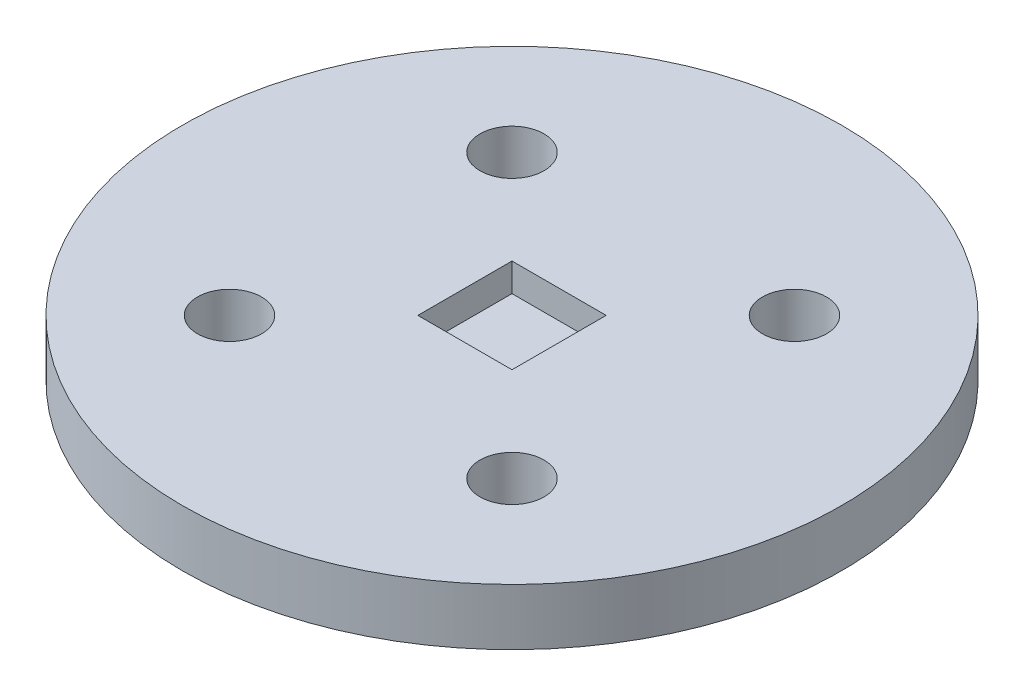
ISO-10303-21;
HEADER;
FILE_DESCRIPTION(('STEP AP214'),'2;1');
FILE_NAME('part.step','',(''),(''),'','','');
FILE_SCHEMA(('AUTOMOTIVE_DESIGN { 1 0 10303 214 1 1 1 1 }'));
ENDSEC;
DATA;
#1=APPLICATION_CONTEXT('core data for automotive mechanical design processes');
#2=APPLICATION_PROTOCOL_DEFINITION('international standard','automotive_design',2000,#1);
#3=PRODUCT_CONTEXT('',#1,'mechanical');
#4=PRODUCT('Part','Part','',(#3));
#5=PRODUCT_RELATED_PRODUCT_CATEGORY('part','',(#4));
#6=PRODUCT_DEFINITION_FORMATION('','',#4);
#7=PRODUCT_DEFINITION_CONTEXT('part definition',#1,'design');
#8=PRODUCT_DEFINITION('design','',#6,#7);
#9=PRODUCT_DEFINITION_SHAPE('','',#8);
#10=(LENGTH_UNIT() NAMED_UNIT(*) SI_UNIT(.MILLI.,.METRE.));
#11=(NAMED_UNIT(*) PLANE_ANGLE_UNIT() SI_UNIT($,.RADIAN.));
#12=(NAMED_UNIT(*) SI_UNIT($,.STERADIAN.) SOLID_ANGLE_UNIT());
#13=UNCERTAINTY_MEASURE_WITH_UNIT(LENGTH_MEASURE(1.E-05),#10,'distance_accuracy_value','');
#14=(GEOMETRIC_REPRESENTATION_CONTEXT(3) GLOBAL_UNCERTAINTY_ASSIGNED_CONTEXT((#13)) GLOBAL_UNIT_ASSIGNED_CONTEXT((#10,
#11,#12)) REPRESENTATION_CONTEXT('',''));
#15=CARTESIAN_POINT('',(0.,0.,0.));
#16=DIRECTION('',(0.,0.,1.));
#17=DIRECTION('',(1.,0.,0.));
#18=AXIS2_PLACEMENT_3D('',#15,#16,#17);
#19=CARTESIAN_POINT('',(0.,6.,0.));
#20=DIRECTION('',(0.,-1.,0.));
#21=DIRECTION('',(0.,0.,-1.));
#22=AXIS2_PLACEMENT_3D('',#19,#20,#21);
#23=CYLINDRICAL_SURFACE('',#22,35.);
#24=CARTESIAN_POINT('',(0.,6.,0.));
#25=DIRECTION('',(0.,1.,0.));
#26=DIRECTION('',(0.,0.,1.));
#27=AXIS2_PLACEMENT_3D('',#24,#25,#26);
#28=CIRCLE('',#27,35.);
#29=CARTESIAN_POINT('',(0.,6.,35.));
#30=VERTEX_POINT('',#29);
#31=EDGE_CURVE('E11',#30,#30,#28,.T.);
#32=ORIENTED_EDGE('',*,*,#31,.F.);
#33=EDGE_LOOP('',(#32));
#34=FACE_BOUND('',#33,.T.);
#35=CARTESIAN_POINT('',(0.,0.,0.));
#36=DIRECTION('',(0.,1.,0.));
#37=DIRECTION('',(0.,0.,1.));
#38=AXIS2_PLACEMENT_3D('',#35,#36,#37);
#39=CIRCLE('',#38,35.);
#40=CARTESIAN_POINT('',(0.,0.,35.));
#41=VERTEX_POINT('',#40);
#42=EDGE_CURVE('E42',#41,#41,#39,.T.);
#43=ORIENTED_EDGE('',*,*,#42,.T.);
#44=EDGE_LOOP('',(#43));
#45=FACE_BOUND('',#44,.T.);
#46=ADVANCED_FACE('F39',(#34,#45),#23,.T.);
#47=CARTESIAN_POINT('',(0.,6.,0.));
#48=DIRECTION('',(0.,1.,0.));
#49=DIRECTION('',(0.,0.,1.));
#50=AXIS2_PLACEMENT_3D('',#47,#48,#49);
#51=PLANE('',#50);
#52=CARTESIAN_POINT('',(-15.,6.,-15.));
#53=DIRECTION('',(0.,-1.,0.));
#54=DIRECTION('',(0.,0.,-1.));
#55=AXIS2_PLACEMENT_3D('',#52,#53,#54);
#56=CIRCLE('',#55,3.4);
#57=CARTESIAN_POINT('',(-15.,6.,-18.4));
#58=VERTEX_POINT('',#57);
#59=EDGE_CURVE('E365',#58,#58,#56,.T.);
#60=ORIENTED_EDGE('',*,*,#59,.T.);
#61=EDGE_LOOP('',(#60));
#62=FACE_BOUND('',#61,.T.);
#63=CARTESIAN_POINT('',(15.,6.,15.));
#64=DIRECTION('',(0.,-1.,0.));
#65=DIRECTION('',(0.,0.,-1.));
#66=AXIS2_PLACEMENT_3D('',#63,#64,#65);
#67=CIRCLE('',#66,3.4);
#68=CARTESIAN_POINT('',(15.,6.,11.6));
#69=VERTEX_POINT('',#68);
#70=EDGE_CURVE('E374',#69,#69,#67,.T.);
#71=ORIENTED_EDGE('',*,*,#70,.T.);
#72=EDGE_LOOP('',(#71));
#73=FACE_BOUND('',#72,.T.);
#74=CARTESIAN_POINT('',(-15.,6.,15.));
#75=DIRECTION('',(0.,-1.,0.));
#76=DIRECTION('',(0.,0.,-1.));
#77=AXIS2_PLACEMENT_3D('',#74,#75,#76);
#78=CIRCLE('',#77,3.4);
#79=CARTESIAN_POINT('',(-15.,6.,11.6));
#80=VERTEX_POINT('',#79);
#81=EDGE_CURVE('E357',#80,#80,#78,.T.);
#82=ORIENTED_EDGE('',*,*,#81,.T.);
#83=EDGE_LOOP('',(#82));
#84=FACE_BOUND('',#83,.T.);
#85=CARTESIAN_POINT('',(15.,6.,-15.));
#86=DIRECTION('',(0.,-1.,0.));
#87=DIRECTION('',(0.,0.,-1.));
#88=AXIS2_PLACEMENT_3D('',#85,#86,#87);
#89=CIRCLE('',#88,3.4);
#90=CARTESIAN_POINT('',(15.,6.,-18.4));
#91=VERTEX_POINT('',#90);
#92=EDGE_CURVE('E381',#91,#91,#89,.T.);
#93=ORIENTED_EDGE('',*,*,#92,.T.);
#94=EDGE_LOOP('',(#93));
#95=FACE_BOUND('',#94,.T.);
#96=DIRECTION('',(0.,0.,-1.));
#97=VECTOR('',#96,1.);
#98=CARTESIAN_POINT('',(5.,6.,5.));
#99=LINE('',#98,#97);
#100=CARTESIAN_POINT('',(5.,6.,5.));
#101=VERTEX_POINT('',#100);
#102=CARTESIAN_POINT('',(5.,6.,-5.));
#103=VERTEX_POINT('',#102);
#104=EDGE_CURVE('E385',#101,#103,#99,.T.);
#105=ORIENTED_EDGE('',*,*,#104,.F.);
#106=DIRECTION('',(1.,0.,0.));
#107=VECTOR('',#106,1.);
#108=CARTESIAN_POINT('',(-5.,6.,5.));
#109=LINE('',#108,#107);
#110=CARTESIAN_POINT('',(-5.,6.,5.));
#111=VERTEX_POINT('',#110);
#112=EDGE_CURVE('E394',#111,#101,#109,.T.);
#113=ORIENTED_EDGE('',*,*,#112,.F.);
#114=DIRECTION('',(0.,0.,1.));
#115=VECTOR('',#114,1.);
#116=CARTESIAN_POINT('',(-5.,6.,5.));
#117=LINE('',#116,#115);
#118=CARTESIAN_POINT('',(-5.,6.,-5.));
#119=VERTEX_POINT('',#118);
#120=EDGE_CURVE('E413',#119,#111,#117,.T.);
#121=ORIENTED_EDGE('',*,*,#120,.F.);
#122=DIRECTION('',(-1.,0.,0.));
#123=VECTOR('',#122,1.);
#124=CARTESIAN_POINT('',(-5.,6.,-5.));
#125=LINE('',#124,#123);
#126=EDGE_CURVE('E409',#103,#119,#125,.T.);
#127=ORIENTED_EDGE('',*,*,#126,.F.);
#128=EDGE_LOOP('',(#105,#113,#121,#127));
#129=FACE_BOUND('',#128,.T.);
#130=ORIENTED_EDGE('',*,*,#31,.T.);
#131=EDGE_LOOP('',(#130));
#132=FACE_BOUND('',#131,.T.);
#133=ADVANCED_FACE('F440',(#62,#73,#84,#95,#129,#132),#51,.T.);
#134=CARTESIAN_POINT('',(0.,0.,0.));
#135=DIRECTION('',(0.,1.,0.));
#136=DIRECTION('',(0.,0.,1.));
#137=AXIS2_PLACEMENT_3D('',#134,#135,#136);
#138=PLANE('',#137);
#139=DIRECTION('',(0.,0.,-1.));
#140=VECTOR('',#139,1.);
#141=CARTESIAN_POINT('',(-26.1991505127554,0.,-3.09645220662024));
#142=LINE('',#141,#140);
#143=CARTESIAN_POINT('',(-26.1991505127555,0.,3.10354779337976));
#144=VERTEX_POINT('',#143);
#145=CARTESIAN_POINT('',(-26.1991505127554,0.,-3.09645220662024));
#146=VERTEX_POINT('',#145);
#147=EDGE_CURVE('E212',#144,#146,#142,.T.);
#148=ORIENTED_EDGE('',*,*,#147,.F.);
#149=DIRECTION('',(-1.,0.,0.));
#150=VECTOR('',#149,1.);
#151=CARTESIAN_POINT('',(-19.9991505127555,0.,3.10354779337978));
#152=LINE('',#151,#150);
#153=CARTESIAN_POINT('',(-19.9991505127555,0.,3.10354779337978));
#154=VERTEX_POINT('',#153);
#155=EDGE_CURVE('E54',#154,#144,#152,.T.);
#156=ORIENTED_EDGE('',*,*,#155,.F.);
#157=DIRECTION('',(0.,0.,1.));
#158=VECTOR('',#157,1.);
#159=CARTESIAN_POINT('',(-19.9991505127554,0.,-3.09645220662022));
#160=LINE('',#159,#158);
#161=CARTESIAN_POINT('',(-19.9991505127554,0.,-3.09645220662022));
#162=VERTEX_POINT('',#161);
#163=EDGE_CURVE('E199',#162,#154,#160,.T.);
#164=ORIENTED_EDGE('',*,*,#163,.F.);
#165=DIRECTION('',(1.,0.,0.));
#166=VECTOR('',#165,1.);
#167=CARTESIAN_POINT('',(-19.9991505127554,0.,-3.09645220662022));
#168=LINE('',#167,#166);
#169=EDGE_CURVE('E203',#146,#162,#168,.T.);
#170=ORIENTED_EDGE('',*,*,#169,.F.);
#171=EDGE_LOOP('',(#148,#156,#164,#170));
#172=FACE_BOUND('',#171,.T.);
#173=DIRECTION('',(-1.,0.,0.));
#174=VECTOR('',#173,1.);
#175=CARTESIAN_POINT('',(-3.09645220661991,0.,26.1991505127558));
#176=LINE('',#175,#174);
#177=CARTESIAN_POINT('',(3.10354779338009,0.,26.1991505127558));
#178=VERTEX_POINT('',#177);
#179=CARTESIAN_POINT('',(-3.09645220661991,0.,26.1991505127558));
#180=VERTEX_POINT('',#179);
#181=EDGE_CURVE('E248',#178,#180,#176,.T.);
#182=ORIENTED_EDGE('',*,*,#181,.F.);
#183=DIRECTION('',(0.,0.,1.));
#184=VECTOR('',#183,1.);
#185=CARTESIAN_POINT('',(3.10354779338008,0.,19.9991505127558));
#186=LINE('',#185,#184);
#187=CARTESIAN_POINT('',(3.10354779338008,0.,19.9991505127558));
#188=VERTEX_POINT('',#187);
#189=EDGE_CURVE('E62',#188,#178,#186,.T.);
#190=ORIENTED_EDGE('',*,*,#189,.F.);
#191=DIRECTION('',(1.,0.,0.));
#192=VECTOR('',#191,1.);
#193=CARTESIAN_POINT('',(-3.09645220661992,0.,19.9991505127558));
#194=LINE('',#193,#192);
#195=CARTESIAN_POINT('',(-3.09645220661992,0.,19.9991505127558));
#196=VERTEX_POINT('',#195);
#197=EDGE_CURVE('E233',#196,#188,#194,.T.);
#198=ORIENTED_EDGE('',*,*,#197,.F.);
#199=DIRECTION('',(0.,0.,-1.));
#200=VECTOR('',#199,1.);
#201=CARTESIAN_POINT('',(-3.09645220661992,0.,19.9991505127558));
#202=LINE('',#201,#200);
#203=EDGE_CURVE('E253',#180,#196,#202,.T.);
#204=ORIENTED_EDGE('',*,*,#203,.F.);
#205=EDGE_LOOP('',(#182,#190,#198,#204));
#206=FACE_BOUND('',#205,.T.);
#207=DIRECTION('',(1.,0.,0.));
#208=VECTOR('',#207,1.);
#209=CARTESIAN_POINT('',(3.09645220662065,0.,-26.1991505127557));
#210=LINE('',#209,#208);
#211=CARTESIAN_POINT('',(-3.10354779337935,0.,-26.1991505127557));
#212=VERTEX_POINT('',#211);
#213=CARTESIAN_POINT('',(3.09645220662065,0.,-26.1991505127557));
#214=VERTEX_POINT('',#213);
#215=EDGE_CURVE('E291',#212,#214,#210,.T.);
#216=ORIENTED_EDGE('',*,*,#215,.F.);
#217=DIRECTION('',(0.,0.,-1.));
#218=VECTOR('',#217,1.);
#219=CARTESIAN_POINT('',(-3.10354779337939,0.,-19.9991505127557));
#220=LINE('',#219,#218);
#221=CARTESIAN_POINT('',(-3.10354779337939,0.,-19.9991505127557));
#222=VERTEX_POINT('',#221);
#223=EDGE_CURVE('E288',#222,#212,#220,.T.);
#224=ORIENTED_EDGE('',*,*,#223,.F.);
#225=DIRECTION('',(-1.,0.,0.));
#226=VECTOR('',#225,1.);
#227=CARTESIAN_POINT('',(3.09645220662061,0.,-19.9991505127557));
#228=LINE('',#227,#226);
#229=CARTESIAN_POINT('',(3.09645220662061,0.,-19.9991505127557));
#230=VERTEX_POINT('',#229);
#231=EDGE_CURVE('E275',#230,#222,#228,.T.);
#232=ORIENTED_EDGE('',*,*,#231,.F.);
#233=DIRECTION('',(0.,0.,1.));
#234=VECTOR('',#233,1.);
#235=CARTESIAN_POINT('',(3.09645220662061,0.,-19.9991505127557));
#236=LINE('',#235,#234);
#237=EDGE_CURVE('E296',#214,#230,#236,.T.);
#238=ORIENTED_EDGE('',*,*,#237,.F.);
#239=EDGE_LOOP('',(#216,#224,#232,#238));
#240=FACE_BOUND('',#239,.T.);
#241=DIRECTION('',(0.,0.,1.));
#242=VECTOR('',#241,1.);
#243=CARTESIAN_POINT('',(26.199150512756,0.,3.09645220662051));
#244=LINE('',#243,#242);
#245=CARTESIAN_POINT('',(26.199150512756,0.,-3.10354779337949));
#246=VERTEX_POINT('',#245);
#247=CARTESIAN_POINT('',(26.199150512756,0.,3.09645220662051));
#248=VERTEX_POINT('',#247);
#249=EDGE_CURVE('E335',#246,#248,#244,.T.);
#250=ORIENTED_EDGE('',*,*,#249,.F.);
#251=DIRECTION('',(1.,0.,0.));
#252=VECTOR('',#251,1.);
#253=CARTESIAN_POINT('',(19.999150512756,0.,-3.10354779337955));
#254=LINE('',#253,#252);
#255=CARTESIAN_POINT('',(19.999150512756,0.,-3.10354779337955));
#256=VERTEX_POINT('',#255);
#257=EDGE_CURVE('E332',#256,#246,#254,.T.);
#258=ORIENTED_EDGE('',*,*,#257,.F.);
#259=DIRECTION('',(0.,0.,-1.));
#260=VECTOR('',#259,1.);
#261=CARTESIAN_POINT('',(19.999150512756,0.,3.09645220662045));
#262=LINE('',#261,#260);
#263=CARTESIAN_POINT('',(19.999150512756,0.,3.09645220662045));
#264=VERTEX_POINT('',#263);
#265=EDGE_CURVE('E319',#264,#256,#262,.T.);
#266=ORIENTED_EDGE('',*,*,#265,.F.);
#267=DIRECTION('',(-1.,0.,0.));
#268=VECTOR('',#267,1.);
#269=CARTESIAN_POINT('',(19.999150512756,0.,3.09645220662045));
#270=LINE('',#269,#268);
#271=EDGE_CURVE('E339',#248,#264,#270,.T.);
#272=ORIENTED_EDGE('',*,*,#271,.F.);
#273=EDGE_LOOP('',(#250,#258,#266,#272));
#274=FACE_BOUND('',#273,.T.);
#275=CARTESIAN_POINT('',(-15.,0.,-15.));
#276=DIRECTION('',(0.,-1.,0.));
#277=DIRECTION('',(0.,0.,-1.));
#278=AXIS2_PLACEMENT_3D('',#275,#276,#277);
#279=CIRCLE('',#278,3.4);
#280=CARTESIAN_POINT('',(-15.,0.,-18.4));
#281=VERTEX_POINT('',#280);
#282=EDGE_CURVE('E370',#281,#281,#279,.T.);
#283=ORIENTED_EDGE('',*,*,#282,.F.);
#284=EDGE_LOOP('',(#283));
#285=FACE_BOUND('',#284,.T.);
#286=CARTESIAN_POINT('',(15.,0.,15.));
#287=DIRECTION('',(0.,-1.,0.));
#288=DIRECTION('',(0.,0.,-1.));
#289=AXIS2_PLACEMENT_3D('',#286,#287,#288);
#290=CIRCLE('',#289,3.4);
#291=CARTESIAN_POINT('',(15.,0.,11.6));
#292=VERTEX_POINT('',#291);
#293=EDGE_CURVE('E361',#292,#292,#290,.T.);
#294=ORIENTED_EDGE('',*,*,#293,.F.);
#295=EDGE_LOOP('',(#294));
#296=FACE_BOUND('',#295,.T.);
#297=CARTESIAN_POINT('',(-15.,0.,15.));
#298=DIRECTION('',(0.,-1.,0.));
#299=DIRECTION('',(0.,0.,-1.));
#300=AXIS2_PLACEMENT_3D('',#297,#298,#299);
#301=CIRCLE('',#300,3.4);
#302=CARTESIAN_POINT('',(-15.,0.,11.6));
#303=VERTEX_POINT('',#302);
#304=EDGE_CURVE('E222',#303,#303,#301,.T.);
#305=ORIENTED_EDGE('',*,*,#304,.F.);
#306=EDGE_LOOP('',(#305));
#307=FACE_BOUND('',#306,.T.);
#308=CARTESIAN_POINT('',(15.,0.,-15.));
#309=DIRECTION('',(0.,-1.,0.));
#310=DIRECTION('',(0.,0.,-1.));
#311=AXIS2_PLACEMENT_3D('',#308,#309,#310);
#312=CIRCLE('',#311,3.4);
#313=CARTESIAN_POINT('',(15.,0.,-18.4));
#314=VERTEX_POINT('',#313);
#315=EDGE_CURVE('E369',#314,#314,#312,.T.);
#316=ORIENTED_EDGE('',*,*,#315,.F.);
#317=EDGE_LOOP('',(#316));
#318=FACE_BOUND('',#317,.T.);
#319=ORIENTED_EDGE('',*,*,#42,.F.);
#320=EDGE_LOOP('',(#319));
#321=FACE_BOUND('',#320,.T.);
#322=ADVANCED_FACE('F459',(#172,#206,#240,#274,#285,#296,#307,#318,#321),#138,.F.);
#323=CARTESIAN_POINT('',(5.,3.,5.));
#324=DIRECTION('',(1.,0.,0.));
#325=DIRECTION('',(0.,0.,-1.));
#326=AXIS2_PLACEMENT_3D('',#323,#324,#325);
#327=PLANE('',#326);
#328=ORIENTED_EDGE('',*,*,#104,.T.);
#329=DIRECTION('',(0.,1.,0.));
#330=VECTOR('',#329,1.);
#331=CARTESIAN_POINT('',(5.,3.,-5.));
#332=LINE('',#331,#330);
#333=CARTESIAN_POINT('',(5.,3.,-5.));
#334=VERTEX_POINT('',#333);
#335=EDGE_CURVE('E406',#334,#103,#332,.T.);
#336=ORIENTED_EDGE('',*,*,#335,.F.);
#337=DIRECTION('',(0.,0.,-1.));
#338=VECTOR('',#337,1.);
#339=CARTESIAN_POINT('',(5.,3.,5.));
#340=LINE('',#339,#338);
#341=CARTESIAN_POINT('',(5.,3.,5.));
#342=VERTEX_POINT('',#341);
#343=EDGE_CURVE('E389',#342,#334,#340,.T.);
#344=ORIENTED_EDGE('',*,*,#343,.F.);
#345=DIRECTION('',(0.,1.,0.));
#346=VECTOR('',#345,1.);
#347=CARTESIAN_POINT('',(5.,3.,5.));
#348=LINE('',#347,#346);
#349=EDGE_CURVE('E420',#342,#101,#348,.T.);
#350=ORIENTED_EDGE('',*,*,#349,.T.);
#351=EDGE_LOOP('',(#328,#336,#344,#350));
#352=FACE_BOUND('',#351,.T.);
#353=ADVANCED_FACE('F449',(#352),#327,.F.);
#354=CARTESIAN_POINT('',(-5.,3.,5.));
#355=DIRECTION('',(0.,0.,1.));
#356=DIRECTION('',(1.,0.,0.));
#357=AXIS2_PLACEMENT_3D('',#354,#355,#356);
#358=PLANE('',#357);
#359=ORIENTED_EDGE('',*,*,#112,.T.);
#360=ORIENTED_EDGE('',*,*,#349,.F.);
#361=DIRECTION('',(1.,0.,0.));
#362=VECTOR('',#361,1.);
#363=CARTESIAN_POINT('',(-5.,3.,5.));
#364=LINE('',#363,#362);
#365=CARTESIAN_POINT('',(-5.,3.,5.));
#366=VERTEX_POINT('',#365);
#367=EDGE_CURVE('E402',#366,#342,#364,.T.);
#368=ORIENTED_EDGE('',*,*,#367,.F.);
#369=DIRECTION('',(0.,1.,0.));
#370=VECTOR('',#369,1.);
#371=CARTESIAN_POINT('',(-5.,3.,5.));
#372=LINE('',#371,#370);
#373=EDGE_CURVE('E423',#366,#111,#372,.T.);
#374=ORIENTED_EDGE('',*,*,#373,.T.);
#375=EDGE_LOOP('',(#359,#360,#368,#374));
#376=FACE_BOUND('',#375,.T.);
#377=ADVANCED_FACE('F451',(#376),#358,.F.);
#378=CARTESIAN_POINT('',(-5.,3.,5.));
#379=DIRECTION('',(-1.,0.,0.));
#380=DIRECTION('',(0.,0.,1.));
#381=AXIS2_PLACEMENT_3D('',#378,#379,#380);
#382=PLANE('',#381);
#383=ORIENTED_EDGE('',*,*,#120,.T.);
#384=ORIENTED_EDGE('',*,*,#373,.F.);
#385=DIRECTION('',(0.,0.,1.));
#386=VECTOR('',#385,1.);
#387=CARTESIAN_POINT('',(-5.,3.,5.));
#388=LINE('',#387,#386);
#389=CARTESIAN_POINT('',(-5.,3.,-5.));
#390=VERTEX_POINT('',#389);
#391=EDGE_CURVE('E398',#390,#366,#388,.T.);
#392=ORIENTED_EDGE('',*,*,#391,.F.);
#393=DIRECTION('',(0.,1.,0.));
#394=VECTOR('',#393,1.);
#395=CARTESIAN_POINT('',(-5.,3.,-5.));
#396=LINE('',#395,#394);
#397=EDGE_CURVE('E426',#390,#119,#396,.T.);
#398=ORIENTED_EDGE('',*,*,#397,.T.);
#399=EDGE_LOOP('',(#383,#384,#392,#398));
#400=FACE_BOUND('',#399,.T.);
#401=ADVANCED_FACE('F444',(#400),#382,.F.);
#402=CARTESIAN_POINT('',(-5.,3.,-5.));
#403=DIRECTION('',(0.,0.,-1.));
#404=DIRECTION('',(-1.,0.,0.));
#405=AXIS2_PLACEMENT_3D('',#402,#403,#404);
#406=PLANE('',#405);
#407=ORIENTED_EDGE('',*,*,#126,.T.);
#408=ORIENTED_EDGE('',*,*,#397,.F.);
#409=DIRECTION('',(-1.,0.,0.));
#410=VECTOR('',#409,1.);
#411=CARTESIAN_POINT('',(-5.,3.,-5.));
#412=LINE('',#411,#410);
#413=EDGE_CURVE('E393',#334,#390,#412,.T.);
#414=ORIENTED_EDGE('',*,*,#413,.F.);
#415=ORIENTED_EDGE('',*,*,#335,.T.);
#416=EDGE_LOOP('',(#407,#408,#414,#415));
#417=FACE_BOUND('',#416,.T.);
#418=ADVANCED_FACE('F434',(#417),#406,.F.);
#419=CARTESIAN_POINT('',(0.,3.,0.));
#420=DIRECTION('',(0.,-1.,0.));
#421=DIRECTION('',(0.,0.,-1.));
#422=AXIS2_PLACEMENT_3D('',#419,#420,#421);
#423=PLANE('',#422);
#424=ORIENTED_EDGE('',*,*,#343,.T.);
#425=ORIENTED_EDGE('',*,*,#413,.T.);
#426=ORIENTED_EDGE('',*,*,#391,.T.);
#427=ORIENTED_EDGE('',*,*,#367,.T.);
#428=EDGE_LOOP('',(#424,#425,#426,#427));
#429=FACE_BOUND('',#428,.T.);
#430=ADVANCED_FACE('F448',(#429),#423,.F.);
#431=CARTESIAN_POINT('',(15.,6.,-15.));
#432=DIRECTION('',(0.,-1.,0.));
#433=DIRECTION('',(0.,0.,-1.));
#434=AXIS2_PLACEMENT_3D('',#431,#432,#433);
#435=CYLINDRICAL_SURFACE('',#434,3.4);
#436=ORIENTED_EDGE('',*,*,#92,.F.);
#437=EDGE_LOOP('',(#436));
#438=FACE_BOUND('',#437,.T.);
#439=ORIENTED_EDGE('',*,*,#315,.T.);
#440=EDGE_LOOP('',(#439));
#441=FACE_BOUND('',#440,.T.);
#442=ADVANCED_FACE('F485',(#438,#441),#435,.F.);
#443=CARTESIAN_POINT('',(-15.,6.,15.));
#444=DIRECTION('',(0.,-1.,0.));
#445=DIRECTION('',(0.,0.,-1.));
#446=AXIS2_PLACEMENT_3D('',#443,#444,#445);
#447=CYLINDRICAL_SURFACE('',#446,3.4);
#448=ORIENTED_EDGE('',*,*,#81,.F.);
#449=EDGE_LOOP('',(#448));
#450=FACE_BOUND('',#449,.T.);
#451=ORIENTED_EDGE('',*,*,#304,.T.);
#452=EDGE_LOOP('',(#451));
#453=FACE_BOUND('',#452,.T.);
#454=ADVANCED_FACE('F489',(#450,#453),#447,.F.);
#455=CARTESIAN_POINT('',(15.,6.,15.));
#456=DIRECTION('',(0.,-1.,0.));
#457=DIRECTION('',(0.,0.,-1.));
#458=AXIS2_PLACEMENT_3D('',#455,#456,#457);
#459=CYLINDRICAL_SURFACE('',#458,3.4);
#460=ORIENTED_EDGE('',*,*,#70,.F.);
#461=EDGE_LOOP('',(#460));
#462=FACE_BOUND('',#461,.T.);
#463=ORIENTED_EDGE('',*,*,#293,.T.);
#464=EDGE_LOOP('',(#463));
#465=FACE_BOUND('',#464,.T.);
#466=ADVANCED_FACE('F493',(#462,#465),#459,.F.);
#467=CARTESIAN_POINT('',(-15.,6.,-15.));
#468=DIRECTION('',(0.,-1.,0.));
#469=DIRECTION('',(0.,0.,-1.));
#470=AXIS2_PLACEMENT_3D('',#467,#468,#469);
#471=CYLINDRICAL_SURFACE('',#470,3.4);
#472=ORIENTED_EDGE('',*,*,#59,.F.);
#473=EDGE_LOOP('',(#472));
#474=FACE_BOUND('',#473,.T.);
#475=ORIENTED_EDGE('',*,*,#282,.T.);
#476=EDGE_LOOP('',(#475));
#477=FACE_BOUND('',#476,.T.);
#478=ADVANCED_FACE('F496',(#474,#477),#471,.F.);
#479=CARTESIAN_POINT('',(19.999150512756,1.5,-3.10354779337955));
#480=DIRECTION('',(0.,0.,-1.));
#481=DIRECTION('',(-1.,0.,0.));
#482=AXIS2_PLACEMENT_3D('',#479,#480,#481);
#483=PLANE('',#482);
#484=ORIENTED_EDGE('',*,*,#257,.T.);
#485=DIRECTION('',(0.,-1.,0.));
#486=VECTOR('',#485,1.);
#487=CARTESIAN_POINT('',(26.199150512756,1.5,-3.10354779337949));
#488=LINE('',#487,#486);
#489=CARTESIAN_POINT('',(26.199150512756,1.5,-3.10354779337949));
#490=VERTEX_POINT('',#489);
#491=EDGE_CURVE('E331',#490,#246,#488,.T.);
#492=ORIENTED_EDGE('',*,*,#491,.F.);
#493=DIRECTION('',(1.,0.,0.));
#494=VECTOR('',#493,1.);
#495=CARTESIAN_POINT('',(19.999150512756,1.5,-3.10354779337955));
#496=LINE('',#495,#494);
#497=CARTESIAN_POINT('',(19.999150512756,1.5,-3.10354779337955));
#498=VERTEX_POINT('',#497);
#499=EDGE_CURVE('E314',#498,#490,#496,.T.);
#500=ORIENTED_EDGE('',*,*,#499,.F.);
#501=DIRECTION('',(0.,-1.,0.));
#502=VECTOR('',#501,1.);
#503=CARTESIAN_POINT('',(19.999150512756,1.5,-3.10354779337955));
#504=LINE('',#503,#502);
#505=EDGE_CURVE('E292',#498,#256,#504,.T.);
#506=ORIENTED_EDGE('',*,*,#505,.T.);
#507=EDGE_LOOP('',(#484,#492,#500,#506));
#508=FACE_BOUND('',#507,.T.);
#509=ADVANCED_FACE('F500',(#508),#483,.F.);
#510=CARTESIAN_POINT('',(19.999150512756,1.5,3.09645220662045));
#511=DIRECTION('',(-1.,0.,0.));
#512=DIRECTION('',(0.,0.,1.));
#513=AXIS2_PLACEMENT_3D('',#510,#511,#512);
#514=PLANE('',#513);
#515=ORIENTED_EDGE('',*,*,#265,.T.);
#516=ORIENTED_EDGE('',*,*,#505,.F.);
#517=DIRECTION('',(0.,0.,-1.));
#518=VECTOR('',#517,1.);
#519=CARTESIAN_POINT('',(19.999150512756,1.5,3.09645220662045));
#520=LINE('',#519,#518);
#521=CARTESIAN_POINT('',(19.999150512756,1.5,3.09645220662045));
#522=VERTEX_POINT('',#521);
#523=EDGE_CURVE('E327',#522,#498,#520,.T.);
#524=ORIENTED_EDGE('',*,*,#523,.F.);
#525=DIRECTION('',(0.,-1.,0.));
#526=VECTOR('',#525,1.);
#527=CARTESIAN_POINT('',(19.999150512756,1.5,3.09645220662045));
#528=LINE('',#527,#526);
#529=EDGE_CURVE('E348',#522,#264,#528,.T.);
#530=ORIENTED_EDGE('',*,*,#529,.T.);
#531=EDGE_LOOP('',(#515,#516,#524,#530));
#532=FACE_BOUND('',#531,.T.);
#533=ADVANCED_FACE('F507',(#532),#514,.F.);
#534=CARTESIAN_POINT('',(19.999150512756,1.5,3.09645220662045));
#535=DIRECTION('',(0.,0.,1.));
#536=DIRECTION('',(1.,0.,0.));
#537=AXIS2_PLACEMENT_3D('',#534,#535,#536);
#538=PLANE('',#537);
#539=ORIENTED_EDGE('',*,*,#271,.T.);
#540=ORIENTED_EDGE('',*,*,#529,.F.);
#541=DIRECTION('',(-1.,0.,0.));
#542=VECTOR('',#541,1.);
#543=CARTESIAN_POINT('',(19.999150512756,1.5,3.09645220662045));
#544=LINE('',#543,#542);
#545=CARTESIAN_POINT('',(26.199150512756,1.5,3.09645220662051));
#546=VERTEX_POINT('',#545);
#547=EDGE_CURVE('E323',#546,#522,#544,.T.);
#548=ORIENTED_EDGE('',*,*,#547,.F.);
#549=DIRECTION('',(0.,-1.,0.));
#550=VECTOR('',#549,1.);
#551=CARTESIAN_POINT('',(26.199150512756,1.5,3.09645220662051));
#552=LINE('',#551,#550);
#553=EDGE_CURVE('E351',#546,#248,#552,.T.);
#554=ORIENTED_EDGE('',*,*,#553,.T.);
#555=EDGE_LOOP('',(#539,#540,#548,#554));
#556=FACE_BOUND('',#555,.T.);
#557=ADVANCED_FACE('F513',(#556),#538,.F.);
#558=CARTESIAN_POINT('',(26.199150512756,1.5,3.09645220662051));
#559=DIRECTION('',(1.,0.,0.));
#560=DIRECTION('',(0.,0.,-1.));
#561=AXIS2_PLACEMENT_3D('',#558,#559,#560);
#562=PLANE('',#561);
#563=ORIENTED_EDGE('',*,*,#249,.T.);
#564=ORIENTED_EDGE('',*,*,#553,.F.);
#565=DIRECTION('',(0.,0.,1.));
#566=VECTOR('',#565,1.);
#567=CARTESIAN_POINT('',(26.199150512756,1.5,3.09645220662051));
#568=LINE('',#567,#566);
#569=EDGE_CURVE('E318',#490,#546,#568,.T.);
#570=ORIENTED_EDGE('',*,*,#569,.F.);
#571=ORIENTED_EDGE('',*,*,#491,.T.);
#572=EDGE_LOOP('',(#563,#564,#570,#571));
#573=FACE_BOUND('',#572,.T.);
#574=ADVANCED_FACE('F509',(#573),#562,.F.);
#575=CARTESIAN_POINT('',(0.,1.5,0.));
#576=DIRECTION('',(0.,1.,0.));
#577=DIRECTION('',(0.,0.,1.));
#578=AXIS2_PLACEMENT_3D('',#575,#576,#577);
#579=PLANE('',#578);
#580=ORIENTED_EDGE('',*,*,#499,.T.);
#581=ORIENTED_EDGE('',*,*,#569,.T.);
#582=ORIENTED_EDGE('',*,*,#547,.T.);
#583=ORIENTED_EDGE('',*,*,#523,.T.);
#584=EDGE_LOOP('',(#580,#581,#582,#583));
#585=FACE_BOUND('',#584,.T.);
#586=ADVANCED_FACE('F512',(#585),#579,.F.);
#587=CARTESIAN_POINT('',(-3.10354779337939,1.5,-19.9991505127557));
#588=DIRECTION('',(-1.,0.,0.));
#589=DIRECTION('',(0.,0.,1.));
#590=AXIS2_PLACEMENT_3D('',#587,#588,#589);
#591=PLANE('',#590);
#592=ORIENTED_EDGE('',*,*,#223,.T.);
#593=DIRECTION('',(0.,-1.,0.));
#594=VECTOR('',#593,1.);
#595=CARTESIAN_POINT('',(-3.10354779337935,1.5,-26.1991505127557));
#596=LINE('',#595,#594);
#597=CARTESIAN_POINT('',(-3.10354779337935,1.5,-26.1991505127557));
#598=VERTEX_POINT('',#597);
#599=EDGE_CURVE('E287',#598,#212,#596,.T.);
#600=ORIENTED_EDGE('',*,*,#599,.F.);
#601=DIRECTION('',(0.,0.,-1.));
#602=VECTOR('',#601,1.);
#603=CARTESIAN_POINT('',(-3.10354779337939,1.5,-19.9991505127557));
#604=LINE('',#603,#602);
#605=CARTESIAN_POINT('',(-3.10354779337939,1.5,-19.9991505127557));
#606=VERTEX_POINT('',#605);
#607=EDGE_CURVE('E270',#606,#598,#604,.T.);
#608=ORIENTED_EDGE('',*,*,#607,.F.);
#609=DIRECTION('',(0.,-1.,0.));
#610=VECTOR('',#609,1.);
#611=CARTESIAN_POINT('',(-3.10354779337939,1.5,-19.9991505127557));
#612=LINE('',#611,#610);
#613=EDGE_CURVE('E249',#606,#222,#612,.T.);
#614=ORIENTED_EDGE('',*,*,#613,.T.);
#615=EDGE_LOOP('',(#592,#600,#608,#614));
#616=FACE_BOUND('',#615,.T.);
#617=ADVANCED_FACE('F523',(#616),#591,.F.);
#618=CARTESIAN_POINT('',(3.09645220662061,1.5,-19.9991505127557));
#619=DIRECTION('',(0.,0.,1.));
#620=DIRECTION('',(1.,0.,0.));
#621=AXIS2_PLACEMENT_3D('',#618,#619,#620);
#622=PLANE('',#621);
#623=ORIENTED_EDGE('',*,*,#231,.T.);
#624=ORIENTED_EDGE('',*,*,#613,.F.);
#625=DIRECTION('',(-1.,0.,0.));
#626=VECTOR('',#625,1.);
#627=CARTESIAN_POINT('',(3.09645220662061,1.5,-19.9991505127557));
#628=LINE('',#627,#626);
#629=CARTESIAN_POINT('',(3.09645220662061,1.5,-19.9991505127557));
#630=VERTEX_POINT('',#629);
#631=EDGE_CURVE('E283',#630,#606,#628,.T.);
#632=ORIENTED_EDGE('',*,*,#631,.F.);
#633=DIRECTION('',(0.,-1.,0.));
#634=VECTOR('',#633,1.);
#635=CARTESIAN_POINT('',(3.09645220662061,1.5,-19.9991505127557));
#636=LINE('',#635,#634);
#637=EDGE_CURVE('E305',#630,#230,#636,.T.);
#638=ORIENTED_EDGE('',*,*,#637,.T.);
#639=EDGE_LOOP('',(#623,#624,#632,#638));
#640=FACE_BOUND('',#639,.T.);
#641=ADVANCED_FACE('F527',(#640),#622,.F.);
#642=CARTESIAN_POINT('',(3.09645220662061,1.5,-19.9991505127557));
#643=DIRECTION('',(1.,0.,0.));
#644=DIRECTION('',(0.,0.,-1.));
#645=AXIS2_PLACEMENT_3D('',#642,#643,#644);
#646=PLANE('',#645);
#647=ORIENTED_EDGE('',*,*,#237,.T.);
#648=ORIENTED_EDGE('',*,*,#637,.F.);
#649=DIRECTION('',(0.,0.,1.));
#650=VECTOR('',#649,1.);
#651=CARTESIAN_POINT('',(3.09645220662061,1.5,-19.9991505127557));
#652=LINE('',#651,#650);
#653=CARTESIAN_POINT('',(3.09645220662065,1.5,-26.1991505127557));
#654=VERTEX_POINT('',#653);
#655=EDGE_CURVE('E279',#654,#630,#652,.T.);
#656=ORIENTED_EDGE('',*,*,#655,.F.);
#657=DIRECTION('',(0.,-1.,0.));
#658=VECTOR('',#657,1.);
#659=CARTESIAN_POINT('',(3.09645220662065,1.5,-26.1991505127557));
#660=LINE('',#659,#658);
#661=EDGE_CURVE('E308',#654,#214,#660,.T.);
#662=ORIENTED_EDGE('',*,*,#661,.T.);
#663=EDGE_LOOP('',(#647,#648,#656,#662));
#664=FACE_BOUND('',#663,.T.);
#665=ADVANCED_FACE('F533',(#664),#646,.F.);
#666=CARTESIAN_POINT('',(3.09645220662065,1.5,-26.1991505127557));
#667=DIRECTION('',(0.,0.,-1.));
#668=DIRECTION('',(-1.,0.,0.));
#669=AXIS2_PLACEMENT_3D('',#666,#667,#668);
#670=PLANE('',#669);
#671=ORIENTED_EDGE('',*,*,#215,.T.);
#672=ORIENTED_EDGE('',*,*,#661,.F.);
#673=DIRECTION('',(1.,0.,0.));
#674=VECTOR('',#673,1.);
#675=CARTESIAN_POINT('',(3.09645220662065,1.5,-26.1991505127557));
#676=LINE('',#675,#674);
#677=EDGE_CURVE('E274',#598,#654,#676,.T.);
#678=ORIENTED_EDGE('',*,*,#677,.F.);
#679=ORIENTED_EDGE('',*,*,#599,.T.);
#680=EDGE_LOOP('',(#671,#672,#678,#679));
#681=FACE_BOUND('',#680,.T.);
#682=ADVANCED_FACE('F529',(#681),#670,.F.);
#683=CARTESIAN_POINT('',(0.,1.5,0.));
#684=DIRECTION('',(0.,1.,0.));
#685=DIRECTION('',(0.,0.,1.));
#686=AXIS2_PLACEMENT_3D('',#683,#684,#685);
#687=PLANE('',#686);
#688=ORIENTED_EDGE('',*,*,#607,.T.);
#689=ORIENTED_EDGE('',*,*,#677,.T.);
#690=ORIENTED_EDGE('',*,*,#655,.T.);
#691=ORIENTED_EDGE('',*,*,#631,.T.);
#692=EDGE_LOOP('',(#688,#689,#690,#691));
#693=FACE_BOUND('',#692,.T.);
#694=ADVANCED_FACE('F532',(#693),#687,.F.);
#695=CARTESIAN_POINT('',(3.10354779338008,1.5,19.9991505127558));
#696=DIRECTION('',(1.,0.,0.));
#697=DIRECTION('',(0.,0.,-1.));
#698=AXIS2_PLACEMENT_3D('',#695,#696,#697);
#699=PLANE('',#698);
#700=ORIENTED_EDGE('',*,*,#189,.T.);
#701=DIRECTION('',(0.,-1.,0.));
#702=VECTOR('',#701,1.);
#703=CARTESIAN_POINT('',(3.10354779338009,1.5,26.1991505127558));
#704=LINE('',#703,#702);
#705=CARTESIAN_POINT('',(3.10354779338009,1.5,26.1991505127558));
#706=VERTEX_POINT('',#705);
#707=EDGE_CURVE('E245',#706,#178,#704,.T.);
#708=ORIENTED_EDGE('',*,*,#707,.F.);
#709=DIRECTION('',(0.,0.,1.));
#710=VECTOR('',#709,1.);
#711=CARTESIAN_POINT('',(3.10354779338008,1.5,19.9991505127558));
#712=LINE('',#711,#710);
#713=CARTESIAN_POINT('',(3.10354779338008,1.5,19.9991505127558));
#714=VERTEX_POINT('',#713);
#715=EDGE_CURVE('E228',#714,#706,#712,.T.);
#716=ORIENTED_EDGE('',*,*,#715,.F.);
#717=DIRECTION('',(0.,-1.,0.));
#718=VECTOR('',#717,1.);
#719=CARTESIAN_POINT('',(3.10354779338008,1.5,19.9991505127558));
#720=LINE('',#719,#718);
#721=EDGE_CURVE('E213',#714,#188,#720,.T.);
#722=ORIENTED_EDGE('',*,*,#721,.T.);
#723=EDGE_LOOP('',(#700,#708,#716,#722));
#724=FACE_BOUND('',#723,.T.);
#725=ADVANCED_FACE('F543',(#724),#699,.F.);
#726=CARTESIAN_POINT('',(-3.09645220661992,1.5,19.9991505127558));
#727=DIRECTION('',(0.,0.,-1.));
#728=DIRECTION('',(-1.,0.,0.));
#729=AXIS2_PLACEMENT_3D('',#726,#727,#728);
#730=PLANE('',#729);
#731=ORIENTED_EDGE('',*,*,#197,.T.);
#732=ORIENTED_EDGE('',*,*,#721,.F.);
#733=DIRECTION('',(1.,0.,0.));
#734=VECTOR('',#733,1.);
#735=CARTESIAN_POINT('',(-3.09645220661992,1.5,19.9991505127558));
#736=LINE('',#735,#734);
#737=CARTESIAN_POINT('',(-3.09645220661992,1.5,19.9991505127558));
#738=VERTEX_POINT('',#737);
#739=EDGE_CURVE('E241',#738,#714,#736,.T.);
#740=ORIENTED_EDGE('',*,*,#739,.F.);
#741=DIRECTION('',(0.,-1.,0.));
#742=VECTOR('',#741,1.);
#743=CARTESIAN_POINT('',(-3.09645220661992,1.5,19.9991505127558));
#744=LINE('',#743,#742);
#745=EDGE_CURVE('E262',#738,#196,#744,.T.);
#746=ORIENTED_EDGE('',*,*,#745,.T.);
#747=EDGE_LOOP('',(#731,#732,#740,#746));
#748=FACE_BOUND('',#747,.T.);
#749=ADVANCED_FACE('F547',(#748),#730,.F.);
#750=CARTESIAN_POINT('',(-3.09645220661992,1.5,19.9991505127558));
#751=DIRECTION('',(-1.,0.,0.));
#752=DIRECTION('',(0.,0.,1.));
#753=AXIS2_PLACEMENT_3D('',#750,#751,#752);
#754=PLANE('',#753);
#755=ORIENTED_EDGE('',*,*,#203,.T.);
#756=ORIENTED_EDGE('',*,*,#745,.F.);
#757=DIRECTION('',(0.,0.,-1.));
#758=VECTOR('',#757,1.);
#759=CARTESIAN_POINT('',(-3.09645220661992,1.5,19.9991505127558));
#760=LINE('',#759,#758);
#761=CARTESIAN_POINT('',(-3.09645220661991,1.5,26.1991505127558));
#762=VERTEX_POINT('',#761);
#763=EDGE_CURVE('E237',#762,#738,#760,.T.);
#764=ORIENTED_EDGE('',*,*,#763,.F.);
#765=DIRECTION('',(0.,-1.,0.));
#766=VECTOR('',#765,1.);
#767=CARTESIAN_POINT('',(-3.09645220661991,1.5,26.1991505127558));
#768=LINE('',#767,#766);
#769=EDGE_CURVE('E265',#762,#180,#768,.T.);
#770=ORIENTED_EDGE('',*,*,#769,.T.);
#771=EDGE_LOOP('',(#755,#756,#764,#770));
#772=FACE_BOUND('',#771,.T.);
#773=ADVANCED_FACE('F552',(#772),#754,.F.);
#774=CARTESIAN_POINT('',(-3.09645220661991,1.5,26.1991505127558));
#775=DIRECTION('',(0.,0.,1.));
#776=DIRECTION('',(1.,0.,0.));
#777=AXIS2_PLACEMENT_3D('',#774,#775,#776);
#778=PLANE('',#777);
#779=ORIENTED_EDGE('',*,*,#181,.T.);
#780=ORIENTED_EDGE('',*,*,#769,.F.);
#781=DIRECTION('',(-1.,0.,0.));
#782=VECTOR('',#781,1.);
#783=CARTESIAN_POINT('',(-3.09645220661991,1.5,26.1991505127558));
#784=LINE('',#783,#782);
#785=EDGE_CURVE('E232',#706,#762,#784,.T.);
#786=ORIENTED_EDGE('',*,*,#785,.F.);
#787=ORIENTED_EDGE('',*,*,#707,.T.);
#788=EDGE_LOOP('',(#779,#780,#786,#787));
#789=FACE_BOUND('',#788,.T.);
#790=ADVANCED_FACE('F548',(#789),#778,.F.);
#791=CARTESIAN_POINT('',(0.,1.5,0.));
#792=DIRECTION('',(0.,1.,0.));
#793=DIRECTION('',(0.,0.,1.));
#794=AXIS2_PLACEMENT_3D('',#791,#792,#793);
#795=PLANE('',#794);
#796=ORIENTED_EDGE('',*,*,#715,.T.);
#797=ORIENTED_EDGE('',*,*,#785,.T.);
#798=ORIENTED_EDGE('',*,*,#763,.T.);
#799=ORIENTED_EDGE('',*,*,#739,.T.);
#800=EDGE_LOOP('',(#796,#797,#798,#799));
#801=FACE_BOUND('',#800,.T.);
#802=ADVANCED_FACE('F551',(#801),#795,.F.);
#803=CARTESIAN_POINT('',(-19.9991505127555,1.5,3.10354779337978));
#804=DIRECTION('',(0.,0.,1.));
#805=DIRECTION('',(1.,0.,0.));
#806=AXIS2_PLACEMENT_3D('',#803,#804,#805);
#807=PLANE('',#806);
#808=ORIENTED_EDGE('',*,*,#155,.T.);
#809=DIRECTION('',(0.,-1.,0.));
#810=VECTOR('',#809,1.);
#811=CARTESIAN_POINT('',(-26.1991505127555,1.5,3.10354779337976));
#812=LINE('',#811,#810);
#813=CARTESIAN_POINT('',(-26.1991505127555,1.5,3.10354779337976));
#814=VERTEX_POINT('',#813);
#815=EDGE_CURVE('E174',#814,#144,#812,.T.);
#816=ORIENTED_EDGE('',*,*,#815,.F.);
#817=DIRECTION('',(-1.,0.,0.));
#818=VECTOR('',#817,1.);
#819=CARTESIAN_POINT('',(-19.9991505127555,1.5,3.10354779337978));
#820=LINE('',#819,#818);
#821=CARTESIAN_POINT('',(-19.9991505127555,1.5,3.10354779337978));
#822=VERTEX_POINT('',#821);
#823=EDGE_CURVE('E178',#822,#814,#820,.T.);
#824=ORIENTED_EDGE('',*,*,#823,.F.);
#825=DIRECTION('',(0.,-1.,0.));
#826=VECTOR('',#825,1.);
#827=CARTESIAN_POINT('',(-19.9991505127555,1.5,3.10354779337978));
#828=LINE('',#827,#826);
#829=EDGE_CURVE('E219',#822,#154,#828,.T.);
#830=ORIENTED_EDGE('',*,*,#829,.T.);
#831=EDGE_LOOP('',(#808,#816,#824,#830));
#832=FACE_BOUND('',#831,.T.);
#833=ADVANCED_FACE('F176',(#832),#807,.F.);
#834=CARTESIAN_POINT('',(-19.9991505127554,1.5,-3.09645220662022));
#835=DIRECTION('',(1.,0.,0.));
#836=DIRECTION('',(0.,0.,-1.));
#837=AXIS2_PLACEMENT_3D('',#834,#835,#836);
#838=PLANE('',#837);
#839=ORIENTED_EDGE('',*,*,#163,.T.);
#840=ORIENTED_EDGE('',*,*,#829,.F.);
#841=DIRECTION('',(0.,0.,1.));
#842=VECTOR('',#841,1.);
#843=CARTESIAN_POINT('',(-19.9991505127554,1.5,-3.09645220662022));
#844=LINE('',#843,#842);
#845=CARTESIAN_POINT('',(-19.9991505127554,1.5,-3.09645220662022));
#846=VERTEX_POINT('',#845);
#847=EDGE_CURVE('E185',#846,#822,#844,.T.);
#848=ORIENTED_EDGE('',*,*,#847,.F.);
#849=DIRECTION('',(0.,-1.,0.));
#850=VECTOR('',#849,1.);
#851=CARTESIAN_POINT('',(-19.9991505127554,1.5,-3.09645220662022));
#852=LINE('',#851,#850);
#853=EDGE_CURVE('E223',#846,#162,#852,.T.);
#854=ORIENTED_EDGE('',*,*,#853,.T.);
#855=EDGE_LOOP('',(#839,#840,#848,#854));
#856=FACE_BOUND('',#855,.T.);
#857=ADVANCED_FACE('F565',(#856),#838,.F.);
#858=CARTESIAN_POINT('',(-19.9991505127554,1.5,-3.09645220662022));
#859=DIRECTION('',(0.,0.,-1.));
#860=DIRECTION('',(-1.,0.,0.));
#861=AXIS2_PLACEMENT_3D('',#858,#859,#860);
#862=PLANE('',#861);
#863=ORIENTED_EDGE('',*,*,#169,.T.);
#864=ORIENTED_EDGE('',*,*,#853,.F.);
#865=DIRECTION('',(1.,0.,0.));
#866=VECTOR('',#865,1.);
#867=CARTESIAN_POINT('',(-19.9991505127554,1.5,-3.09645220662022));
#868=LINE('',#867,#866);
#869=CARTESIAN_POINT('',(-26.1991505127554,1.5,-3.09645220662024));
#870=VERTEX_POINT('',#869);
#871=EDGE_CURVE('E194',#870,#846,#868,.T.);
#872=ORIENTED_EDGE('',*,*,#871,.F.);
#873=DIRECTION('',(0.,-1.,0.));
#874=VECTOR('',#873,1.);
#875=CARTESIAN_POINT('',(-26.1991505127554,1.5,-3.09645220662024));
#876=LINE('',#875,#874);
#877=EDGE_CURVE('E184',#870,#146,#876,.T.);
#878=ORIENTED_EDGE('',*,*,#877,.T.);
#879=EDGE_LOOP('',(#863,#864,#872,#878));
#880=FACE_BOUND('',#879,.T.);
#881=ADVANCED_FACE('F568',(#880),#862,.F.);
#882=CARTESIAN_POINT('',(-26.1991505127554,1.5,-3.09645220662024));
#883=DIRECTION('',(-1.,0.,0.));
#884=DIRECTION('',(0.,0.,1.));
#885=AXIS2_PLACEMENT_3D('',#882,#883,#884);
#886=PLANE('',#885);
#887=ORIENTED_EDGE('',*,*,#147,.T.);
#888=ORIENTED_EDGE('',*,*,#877,.F.);
#889=DIRECTION('',(0.,0.,-1.));
#890=VECTOR('',#889,1.);
#891=CARTESIAN_POINT('',(-26.1991505127554,1.5,-3.09645220662024));
#892=LINE('',#891,#890);
#893=EDGE_CURVE('E188',#814,#870,#892,.T.);
#894=ORIENTED_EDGE('',*,*,#893,.F.);
#895=ORIENTED_EDGE('',*,*,#815,.T.);
#896=EDGE_LOOP('',(#887,#888,#894,#895));
#897=FACE_BOUND('',#896,.T.);
#898=ADVANCED_FACE('F189',(#897),#886,.F.);
#899=CARTESIAN_POINT('',(0.,1.5,0.));
#900=DIRECTION('',(0.,1.,0.));
#901=DIRECTION('',(0.,0.,1.));
#902=AXIS2_PLACEMENT_3D('',#899,#900,#901);
#903=PLANE('',#902);
#904=ORIENTED_EDGE('',*,*,#823,.T.);
#905=ORIENTED_EDGE('',*,*,#893,.T.);
#906=ORIENTED_EDGE('',*,*,#871,.T.);
#907=ORIENTED_EDGE('',*,*,#847,.T.);
#908=EDGE_LOOP('',(#904,#905,#906,#907));
#909=FACE_BOUND('',#908,.T.);
#910=ADVANCED_FACE('F196',(#909),#903,.F.);
#911=CLOSED_SHELL('',(#46,#133,#322,#353,#377,#401,#418,#430,#442,#454,#466,#478,#509,#533,#557,
#574,#586,#617,#641,#665,#682,#694,#725,#749,#773,#790,#802,#833,#857,#881,#898,#910));
#912=MANIFOLD_SOLID_BREP('B2',#911);
#913=ADVANCED_BREP_SHAPE_REPRESENTATION('',(#18,#912),#14);
#914=SHAPE_DEFINITION_REPRESENTATION(#9,#913);
ENDSEC;
END-ISO-10303-21;
